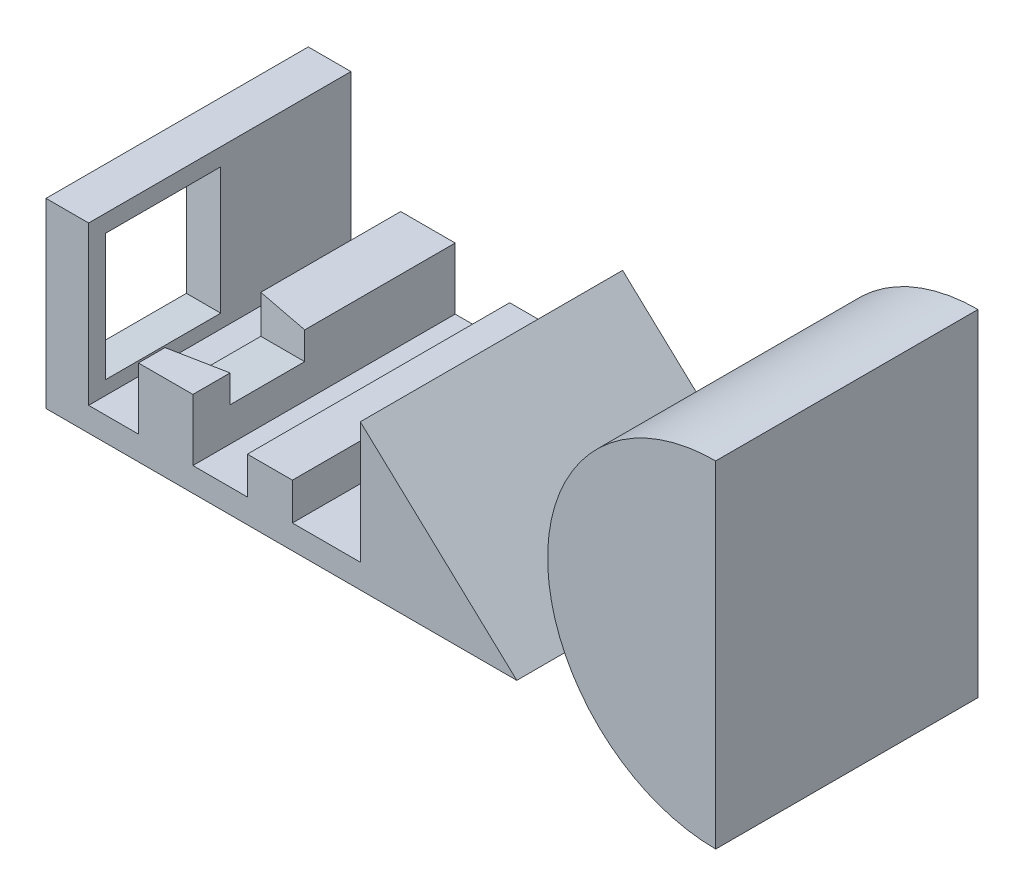
ISO-10303-21;
HEADER;
FILE_DESCRIPTION(('STEP AP214'),'2;1');
FILE_NAME('part.step','',(''),(''),'','','');
FILE_SCHEMA(('AUTOMOTIVE_DESIGN { 1 0 10303 214 1 1 1 1 }'));
ENDSEC;
DATA;
#1=APPLICATION_CONTEXT('core data for automotive mechanical design processes');
#2=APPLICATION_PROTOCOL_DEFINITION('international standard','automotive_design',2000,#1);
#3=PRODUCT_CONTEXT('',#1,'mechanical');
#4=PRODUCT('Part','Part','',(#3));
#5=PRODUCT_RELATED_PRODUCT_CATEGORY('part','',(#4));
#6=PRODUCT_DEFINITION_FORMATION('','',#4);
#7=PRODUCT_DEFINITION_CONTEXT('part definition',#1,'design');
#8=PRODUCT_DEFINITION('design','',#6,#7);
#9=PRODUCT_DEFINITION_SHAPE('','',#8);
#10=(LENGTH_UNIT() NAMED_UNIT(*) SI_UNIT(.MILLI.,.METRE.));
#11=(NAMED_UNIT(*) PLANE_ANGLE_UNIT() SI_UNIT($,.RADIAN.));
#12=(NAMED_UNIT(*) SI_UNIT($,.STERADIAN.) SOLID_ANGLE_UNIT());
#13=UNCERTAINTY_MEASURE_WITH_UNIT(LENGTH_MEASURE(1.E-05),#10,'distance_accuracy_value','');
#14=(GEOMETRIC_REPRESENTATION_CONTEXT(3) GLOBAL_UNCERTAINTY_ASSIGNED_CONTEXT((#13)) GLOBAL_UNIT_ASSIGNED_CONTEXT((#10,
#11,#12)) REPRESENTATION_CONTEXT('',''));
#15=CARTESIAN_POINT('',(0.,0.,0.));
#16=DIRECTION('',(0.,0.,1.));
#17=DIRECTION('',(1.,0.,0.));
#18=AXIS2_PLACEMENT_3D('',#15,#16,#17);
#19=CARTESIAN_POINT('',(972.879836168344,176.420111136161,190.5));
#20=DIRECTION('',(0.,0.,-1.));
#21=DIRECTION('',(-1.,0.,0.));
#22=AXIS2_PLACEMENT_3D('',#19,#20,#21);
#23=CYLINDRICAL_SURFACE('',#22,244.183019467738);
#24=CARTESIAN_POINT('',(972.879836168344,176.420111136161,-190.5));
#25=DIRECTION('',(0.,0.,1.));
#26=DIRECTION('',(1.,0.,0.));
#27=AXIS2_PLACEMENT_3D('',#24,#25,#26);
#28=CIRCLE('',#27,244.183019467738);
#29=CARTESIAN_POINT('',(972.879836168344,420.603130603899,-190.5));
#30=VERTEX_POINT('',#29);
#31=CARTESIAN_POINT('',(972.879836168344,-67.7629083315776,-190.5));
#32=VERTEX_POINT('',#31);
#33=EDGE_CURVE('E79',#30,#32,#28,.T.);
#34=ORIENTED_EDGE('',*,*,#33,.T.);
#35=DIRECTION('',(0.,0.,-1.));
#36=VECTOR('',#35,1.);
#37=CARTESIAN_POINT('',(972.879836168344,-67.7629083315776,190.5));
#38=LINE('',#37,#36);
#39=CARTESIAN_POINT('',(972.879836168344,-67.7629083315776,190.5));
#40=VERTEX_POINT('',#39);
#41=EDGE_CURVE('E12',#40,#32,#38,.T.);
#42=ORIENTED_EDGE('',*,*,#41,.F.);
#43=CARTESIAN_POINT('',(972.879836168344,176.420111136161,190.5));
#44=DIRECTION('',(0.,0.,1.));
#45=DIRECTION('',(1.,0.,0.));
#46=AXIS2_PLACEMENT_3D('',#43,#44,#45);
#47=CIRCLE('',#46,244.183019467738);
#48=CARTESIAN_POINT('',(972.879836168344,420.603130603899,190.5));
#49=VERTEX_POINT('',#48);
#50=EDGE_CURVE('E78',#49,#40,#47,.T.);
#51=ORIENTED_EDGE('',*,*,#50,.F.);
#52=DIRECTION('',(0.,0.,-1.));
#53=VECTOR('',#52,1.);
#54=CARTESIAN_POINT('',(972.879836168344,420.603130603899,190.5));
#55=LINE('',#54,#53);
#56=EDGE_CURVE('E56',#49,#30,#55,.T.);
#57=ORIENTED_EDGE('',*,*,#56,.T.);
#58=EDGE_LOOP('',(#34,#42,#51,#57));
#59=FACE_BOUND('',#58,.T.);
#60=ADVANCED_FACE('F48',(#59),#23,.T.);
#61=CARTESIAN_POINT('',(972.879836168344,420.603130603899,190.5));
#62=DIRECTION('',(-1.,0.,0.));
#63=DIRECTION('',(0.,0.,1.));
#64=AXIS2_PLACEMENT_3D('',#61,#62,#63);
#65=PLANE('',#64);
#66=DIRECTION('',(0.,1.,0.));
#67=VECTOR('',#66,1.);
#68=CARTESIAN_POINT('',(972.879836168344,420.603130603899,-190.5));
#69=LINE('',#68,#67);
#70=EDGE_CURVE('E71',#32,#30,#69,.T.);
#71=ORIENTED_EDGE('',*,*,#70,.T.);
#72=ORIENTED_EDGE('',*,*,#56,.F.);
#73=DIRECTION('',(0.,1.,0.));
#74=VECTOR('',#73,1.);
#75=CARTESIAN_POINT('',(972.879836168344,420.603130603899,190.5));
#76=LINE('',#75,#74);
#77=EDGE_CURVE('E63',#40,#49,#76,.T.);
#78=ORIENTED_EDGE('',*,*,#77,.F.);
#79=ORIENTED_EDGE('',*,*,#41,.T.);
#80=EDGE_LOOP('',(#71,#72,#78,#79));
#81=FACE_BOUND('',#80,.T.);
#82=ADVANCED_FACE('F74',(#81),#65,.F.);
#83=CARTESIAN_POINT('',(972.879836168344,176.420111136161,190.5));
#84=DIRECTION('',(0.,0.,1.));
#85=DIRECTION('',(1.,0.,0.));
#86=AXIS2_PLACEMENT_3D('',#83,#84,#85);
#87=PLANE('',#86);
#88=ORIENTED_EDGE('',*,*,#50,.T.);
#89=ORIENTED_EDGE('',*,*,#77,.T.);
#90=EDGE_LOOP('',(#88,#89));
#91=FACE_BOUND('',#90,.T.);
#92=ADVANCED_FACE('F86',(#91),#87,.T.);
#93=CARTESIAN_POINT('',(972.879836168344,176.420111136161,-190.5));
#94=DIRECTION('',(0.,0.,1.));
#95=DIRECTION('',(1.,0.,0.));
#96=AXIS2_PLACEMENT_3D('',#93,#94,#95);
#97=PLANE('',#96);
#98=ORIENTED_EDGE('',*,*,#33,.F.);
#99=ORIENTED_EDGE('',*,*,#70,.F.);
#100=EDGE_LOOP('',(#98,#99));
#101=FACE_BOUND('',#100,.T.);
#102=ADVANCED_FACE('F82',(#101),#97,.F.);
#103=CLOSED_SHELL('',(#60,#82,#92,#102));
#104=MANIFOLD_SOLID_BREP('B2',#103);
#105=CARTESIAN_POINT('',(134.22680343751,124.475283529657,190.5));
#106=DIRECTION('',(0.,-1.,0.));
#107=DIRECTION('',(0.,0.,-1.));
#108=AXIS2_PLACEMENT_3D('',#105,#106,#107);
#109=PLANE('',#108);
#110=DIRECTION('',(0.,0.,-1.));
#111=VECTOR('',#110,1.);
#112=CARTESIAN_POINT('',(134.22680343751,124.475283529657,190.5));
#113=LINE('',#112,#111);
#114=CARTESIAN_POINT('',(134.22680343751,124.475283529657,12.672751750011));
#115=VERTEX_POINT('',#114);
#116=CARTESIAN_POINT('',(134.22680343751,124.475283529657,-190.5));
#117=VERTEX_POINT('',#116);
#118=EDGE_CURVE('E419',#115,#117,#113,.T.);
#119=ORIENTED_EDGE('',*,*,#118,.F.);
#120=DIRECTION('',(0.981627183447664,0.,0.190808995376545));
#121=VECTOR('',#120,1.);
#122=CARTESIAN_POINT('',(167.534433279237,124.475283529657,19.1470991352906));
#123=LINE('',#122,#121);
#124=CARTESIAN_POINT('',(213.386200336555,124.475283529657,28.0597797904026));
#125=VERTEX_POINT('',#124);
#126=EDGE_CURVE('E334',#115,#125,#123,.T.);
#127=ORIENTED_EDGE('',*,*,#126,.T.);
#128=DIRECTION('',(0.,0.,-1.));
#129=VECTOR('',#128,1.);
#130=CARTESIAN_POINT('',(213.386200336555,124.475283529657,190.5));
#131=LINE('',#130,#129);
#132=CARTESIAN_POINT('',(213.386200336555,124.475283529657,-190.5));
#133=VERTEX_POINT('',#132);
#134=EDGE_CURVE('E423',#125,#133,#131,.T.);
#135=ORIENTED_EDGE('',*,*,#134,.T.);
#136=DIRECTION('',(-1.,0.,0.));
#137=VECTOR('',#136,1.);
#138=CARTESIAN_POINT('',(134.22680343751,124.475283529657,-190.5));
#139=LINE('',#138,#137);
#140=EDGE_CURVE('E393',#133,#117,#139,.T.);
#141=ORIENTED_EDGE('',*,*,#140,.T.);
#142=EDGE_LOOP('',(#119,#127,#135,#141));
#143=FACE_BOUND('',#142,.T.);
#144=ADVANCED_FACE('F120',(#143),#109,.F.);
#145=CARTESIAN_POINT('',(683.937189207744,0.,190.5));
#146=DIRECTION('',(0.,1.,0.));
#147=DIRECTION('',(0.,0.,1.));
#148=AXIS2_PLACEMENT_3D('',#145,#146,#147);
#149=PLANE('',#148);
#150=DIRECTION('',(1.,0.,0.));
#151=VECTOR('',#150,1.);
#152=CARTESIAN_POINT('',(683.937189207744,0.,-190.5));
#153=LINE('',#152,#151);
#154=CARTESIAN_POINT('',(0.,0.,-190.5));
#155=VERTEX_POINT('',#154);
#156=CARTESIAN_POINT('',(683.937189207744,0.,-190.5));
#157=VERTEX_POINT('',#156);
#158=EDGE_CURVE('E340',#155,#157,#153,.T.);
#159=ORIENTED_EDGE('',*,*,#158,.T.);
#160=DIRECTION('',(0.,0.,-1.));
#161=VECTOR('',#160,1.);
#162=CARTESIAN_POINT('',(683.937189207744,0.,190.5));
#163=LINE('',#162,#161);
#164=CARTESIAN_POINT('',(683.937189207744,0.,190.5));
#165=VERTEX_POINT('',#164);
#166=EDGE_CURVE('E46',#165,#157,#163,.T.);
#167=ORIENTED_EDGE('',*,*,#166,.F.);
#168=DIRECTION('',(1.,0.,0.));
#169=VECTOR('',#168,1.);
#170=CARTESIAN_POINT('',(683.937189207744,0.,190.5));
#171=LINE('',#170,#169);
#172=CARTESIAN_POINT('',(0.,0.,190.5));
#173=VERTEX_POINT('',#172);
#174=EDGE_CURVE('E341',#173,#165,#171,.T.);
#175=ORIENTED_EDGE('',*,*,#174,.F.);
#176=DIRECTION('',(0.,0.,-1.));
#177=VECTOR('',#176,1.);
#178=CARTESIAN_POINT('',(0.,0.,190.5));
#179=LINE('',#178,#177);
#180=EDGE_CURVE('E373',#173,#155,#179,.T.);
#181=ORIENTED_EDGE('',*,*,#180,.T.);
#182=EDGE_LOOP('',(#159,#167,#175,#181));
#183=FACE_BOUND('',#182,.T.);
#184=ADVANCED_FACE('F122',(#183),#149,.F.);
#185=CARTESIAN_POINT('',(456.600579214778,211.665343882228,190.5));
#186=DIRECTION('',(-0.681430807762917,-0.731882541280756,0.));
#187=DIRECTION('',(0.731882541280756,-0.681430807762917,0.));
#188=AXIS2_PLACEMENT_3D('',#185,#186,#187);
#189=PLANE('',#188);
#190=DIRECTION('',(-0.731882541280756,0.681430807762917,0.));
#191=VECTOR('',#190,1.);
#192=CARTESIAN_POINT('',(456.600579214778,211.665343882228,-190.5));
#193=LINE('',#192,#191);
#194=CARTESIAN_POINT('',(456.600579214778,211.665343882228,-190.5));
#195=VERTEX_POINT('',#194);
#196=EDGE_CURVE('E376',#157,#195,#193,.T.);
#197=ORIENTED_EDGE('',*,*,#196,.T.);
#198=DIRECTION('',(0.,0.,-1.));
#199=VECTOR('',#198,1.);
#200=CARTESIAN_POINT('',(456.600579214778,211.665343882228,190.5));
#201=LINE('',#200,#199);
#202=CARTESIAN_POINT('',(456.600579214778,211.665343882228,190.5));
#203=VERTEX_POINT('',#202);
#204=EDGE_CURVE('E128',#203,#195,#201,.T.);
#205=ORIENTED_EDGE('',*,*,#204,.F.);
#206=DIRECTION('',(-0.731882541280756,0.681430807762917,0.));
#207=VECTOR('',#206,1.);
#208=CARTESIAN_POINT('',(456.600579214778,211.665343882228,190.5));
#209=LINE('',#208,#207);
#210=EDGE_CURVE('E344',#165,#203,#209,.T.);
#211=ORIENTED_EDGE('',*,*,#210,.F.);
#212=ORIENTED_EDGE('',*,*,#166,.T.);
#213=EDGE_LOOP('',(#197,#205,#211,#212));
#214=FACE_BOUND('',#213,.T.);
#215=ADVANCED_FACE('F472',(#214),#189,.F.);
#216=CARTESIAN_POINT('',(456.600579214778,34.9907479046501,190.5));
#217=DIRECTION('',(1.,0.,0.));
#218=DIRECTION('',(0.,0.,-1.));
#219=AXIS2_PLACEMENT_3D('',#216,#217,#218);
#220=PLANE('',#219);
#221=DIRECTION('',(0.,-1.,0.));
#222=VECTOR('',#221,1.);
#223=CARTESIAN_POINT('',(456.600579214778,34.9907479046501,-190.5));
#224=LINE('',#223,#222);
#225=CARTESIAN_POINT('',(456.600579214778,34.9907479046501,-190.5));
#226=VERTEX_POINT('',#225);
#227=EDGE_CURVE('E378',#195,#226,#224,.T.);
#228=ORIENTED_EDGE('',*,*,#227,.T.);
#229=DIRECTION('',(0.,0.,-1.));
#230=VECTOR('',#229,1.);
#231=CARTESIAN_POINT('',(456.600579214778,34.9907479046501,190.5));
#232=LINE('',#231,#230);
#233=CARTESIAN_POINT('',(456.600579214778,34.9907479046501,190.5));
#234=VERTEX_POINT('',#233);
#235=EDGE_CURVE('E442',#234,#226,#232,.T.);
#236=ORIENTED_EDGE('',*,*,#235,.F.);
#237=DIRECTION('',(0.,-1.,0.));
#238=VECTOR('',#237,1.);
#239=CARTESIAN_POINT('',(456.600579214778,34.9907479046501,190.5));
#240=LINE('',#239,#238);
#241=EDGE_CURVE('E347',#203,#234,#240,.T.);
#242=ORIENTED_EDGE('',*,*,#241,.F.);
#243=ORIENTED_EDGE('',*,*,#204,.T.);
#244=EDGE_LOOP('',(#228,#236,#242,#243));
#245=FACE_BOUND('',#244,.T.);
#246=ADVANCED_FACE('F449',(#245),#220,.F.);
#247=CARTESIAN_POINT('',(357.938142500027,34.9907479046501,190.5));
#248=DIRECTION('',(0.,-1.,0.));
#249=DIRECTION('',(0.,0.,-1.));
#250=AXIS2_PLACEMENT_3D('',#247,#248,#249);
#251=PLANE('',#250);
#252=DIRECTION('',(-1.,0.,0.));
#253=VECTOR('',#252,1.);
#254=CARTESIAN_POINT('',(357.938142500027,34.9907479046501,-190.5));
#255=LINE('',#254,#253);
#256=CARTESIAN_POINT('',(357.938142500027,34.9907479046501,-190.5));
#257=VERTEX_POINT('',#256);
#258=EDGE_CURVE('E380',#226,#257,#255,.T.);
#259=ORIENTED_EDGE('',*,*,#258,.T.);
#260=DIRECTION('',(0.,0.,-1.));
#261=VECTOR('',#260,1.);
#262=CARTESIAN_POINT('',(357.938142500027,34.9907479046501,190.5));
#263=LINE('',#262,#261);
#264=CARTESIAN_POINT('',(357.938142500027,34.9907479046501,190.5));
#265=VERTEX_POINT('',#264);
#266=EDGE_CURVE('E439',#265,#257,#263,.T.);
#267=ORIENTED_EDGE('',*,*,#266,.F.);
#268=DIRECTION('',(-1.,0.,0.));
#269=VECTOR('',#268,1.);
#270=CARTESIAN_POINT('',(357.938142500027,34.9907479046501,190.5));
#271=LINE('',#270,#269);
#272=EDGE_CURVE('E349',#234,#265,#271,.T.);
#273=ORIENTED_EDGE('',*,*,#272,.F.);
#274=ORIENTED_EDGE('',*,*,#235,.T.);
#275=EDGE_LOOP('',(#259,#267,#273,#274));
#276=FACE_BOUND('',#275,.T.);
#277=ADVANCED_FACE('F460',(#276),#251,.F.);
#278=CARTESIAN_POINT('',(357.938142500027,88.9109168068977,190.5));
#279=DIRECTION('',(-1.,0.,0.));
#280=DIRECTION('',(0.,0.,1.));
#281=AXIS2_PLACEMENT_3D('',#278,#279,#280);
#282=PLANE('',#281);
#283=DIRECTION('',(0.,1.,0.));
#284=VECTOR('',#283,1.);
#285=CARTESIAN_POINT('',(357.938142500027,88.9109168068977,-190.5));
#286=LINE('',#285,#284);
#287=CARTESIAN_POINT('',(357.938142500027,88.9109168068977,-190.5));
#288=VERTEX_POINT('',#287);
#289=EDGE_CURVE('E382',#257,#288,#286,.T.);
#290=ORIENTED_EDGE('',*,*,#289,.T.);
#291=DIRECTION('',(0.,0.,-1.));
#292=VECTOR('',#291,1.);
#293=CARTESIAN_POINT('',(357.938142500027,88.9109168068977,190.5));
#294=LINE('',#293,#292);
#295=CARTESIAN_POINT('',(357.938142500027,88.9109168068977,190.5));
#296=VERTEX_POINT('',#295);
#297=EDGE_CURVE('E436',#296,#288,#294,.T.);
#298=ORIENTED_EDGE('',*,*,#297,.F.);
#299=DIRECTION('',(0.,1.,0.));
#300=VECTOR('',#299,1.);
#301=CARTESIAN_POINT('',(357.938142500027,88.9109168068977,190.5));
#302=LINE('',#301,#300);
#303=EDGE_CURVE('E351',#265,#296,#302,.T.);
#304=ORIENTED_EDGE('',*,*,#303,.F.);
#305=ORIENTED_EDGE('',*,*,#266,.T.);
#306=EDGE_LOOP('',(#290,#298,#304,#305));
#307=FACE_BOUND('',#306,.T.);
#308=ADVANCED_FACE('F464',(#307),#282,.F.);
#309=CARTESIAN_POINT('',(292.545597235599,88.9109168068977,190.5));
#310=DIRECTION('',(0.,-1.,0.));
#311=DIRECTION('',(0.,0.,-1.));
#312=AXIS2_PLACEMENT_3D('',#309,#310,#311);
#313=PLANE('',#312);
#314=DIRECTION('',(-1.,0.,0.));
#315=VECTOR('',#314,1.);
#316=CARTESIAN_POINT('',(292.545597235599,88.9109168068977,-190.5));
#317=LINE('',#316,#315);
#318=CARTESIAN_POINT('',(292.545597235599,88.9109168068977,-190.5));
#319=VERTEX_POINT('',#318);
#320=EDGE_CURVE('E384',#288,#319,#317,.T.);
#321=ORIENTED_EDGE('',*,*,#320,.T.);
#322=DIRECTION('',(0.,0.,-1.));
#323=VECTOR('',#322,1.);
#324=CARTESIAN_POINT('',(292.545597235599,88.9109168068977,190.5));
#325=LINE('',#324,#323);
#326=CARTESIAN_POINT('',(292.545597235599,88.9109168068977,190.5));
#327=VERTEX_POINT('',#326);
#328=EDGE_CURVE('E433',#327,#319,#325,.T.);
#329=ORIENTED_EDGE('',*,*,#328,.F.);
#330=DIRECTION('',(-1.,0.,0.));
#331=VECTOR('',#330,1.);
#332=CARTESIAN_POINT('',(292.545597235599,88.9109168068977,190.5));
#333=LINE('',#332,#331);
#334=EDGE_CURVE('E353',#296,#327,#333,.T.);
#335=ORIENTED_EDGE('',*,*,#334,.F.);
#336=ORIENTED_EDGE('',*,*,#297,.T.);
#337=EDGE_LOOP('',(#321,#329,#335,#336));
#338=FACE_BOUND('',#337,.T.);
#339=ADVANCED_FACE('F517',(#338),#313,.F.);
#340=CARTESIAN_POINT('',(292.545597235599,34.9907479046501,190.5));
#341=DIRECTION('',(1.,0.,0.));
#342=DIRECTION('',(0.,0.,-1.));
#343=AXIS2_PLACEMENT_3D('',#340,#341,#342);
#344=PLANE('',#343);
#345=DIRECTION('',(0.,-1.,0.));
#346=VECTOR('',#345,1.);
#347=CARTESIAN_POINT('',(292.545597235599,34.9907479046501,-190.5));
#348=LINE('',#347,#346);
#349=CARTESIAN_POINT('',(292.545597235599,34.9907479046501,-190.5));
#350=VERTEX_POINT('',#349);
#351=EDGE_CURVE('E386',#319,#350,#348,.T.);
#352=ORIENTED_EDGE('',*,*,#351,.T.);
#353=DIRECTION('',(0.,0.,-1.));
#354=VECTOR('',#353,1.);
#355=CARTESIAN_POINT('',(292.545597235599,34.9907479046501,190.5));
#356=LINE('',#355,#354);
#357=CARTESIAN_POINT('',(292.545597235599,34.9907479046501,190.5));
#358=VERTEX_POINT('',#357);
#359=EDGE_CURVE('E430',#358,#350,#356,.T.);
#360=ORIENTED_EDGE('',*,*,#359,.F.);
#361=DIRECTION('',(0.,-1.,0.));
#362=VECTOR('',#361,1.);
#363=CARTESIAN_POINT('',(292.545597235599,34.9907479046501,190.5));
#364=LINE('',#363,#362);
#365=EDGE_CURVE('E355',#327,#358,#364,.T.);
#366=ORIENTED_EDGE('',*,*,#365,.F.);
#367=ORIENTED_EDGE('',*,*,#328,.T.);
#368=EDGE_LOOP('',(#352,#360,#366,#367));
#369=FACE_BOUND('',#368,.T.);
#370=ADVANCED_FACE('F515',(#369),#344,.F.);
#371=CARTESIAN_POINT('',(213.386200336555,34.9907479046501,190.5));
#372=DIRECTION('',(0.,-1.,0.));
#373=DIRECTION('',(0.,0.,-1.));
#374=AXIS2_PLACEMENT_3D('',#371,#372,#373);
#375=PLANE('',#374);
#376=DIRECTION('',(-1.,0.,0.));
#377=VECTOR('',#376,1.);
#378=CARTESIAN_POINT('',(213.386200336555,34.9907479046501,-190.5));
#379=LINE('',#378,#377);
#380=CARTESIAN_POINT('',(213.386200336555,34.9907479046501,-190.5));
#381=VERTEX_POINT('',#380);
#382=EDGE_CURVE('E388',#350,#381,#379,.T.);
#383=ORIENTED_EDGE('',*,*,#382,.T.);
#384=DIRECTION('',(0.,0.,-1.));
#385=VECTOR('',#384,1.);
#386=CARTESIAN_POINT('',(213.386200336555,34.9907479046501,190.5));
#387=LINE('',#386,#385);
#388=CARTESIAN_POINT('',(213.386200336555,34.9907479046501,190.5));
#389=VERTEX_POINT('',#388);
#390=EDGE_CURVE('E427',#389,#381,#387,.T.);
#391=ORIENTED_EDGE('',*,*,#390,.F.);
#392=DIRECTION('',(-1.,0.,0.));
#393=VECTOR('',#392,1.);
#394=CARTESIAN_POINT('',(213.386200336555,34.9907479046501,190.5));
#395=LINE('',#394,#393);
#396=EDGE_CURVE('E357',#358,#389,#395,.T.);
#397=ORIENTED_EDGE('',*,*,#396,.F.);
#398=ORIENTED_EDGE('',*,*,#359,.T.);
#399=EDGE_LOOP('',(#383,#391,#397,#398));
#400=FACE_BOUND('',#399,.T.);
#401=ADVANCED_FACE('F511',(#400),#375,.F.);
#402=CARTESIAN_POINT('',(213.386200336555,124.475283529657,190.5));
#403=DIRECTION('',(-1.,0.,0.));
#404=DIRECTION('',(0.,0.,1.));
#405=AXIS2_PLACEMENT_3D('',#402,#403,#404);
#406=PLANE('',#405);
#407=ORIENTED_EDGE('',*,*,#134,.F.);
#408=DIRECTION('',(0.,-1.,0.));
#409=VECTOR('',#408,1.);
#410=CARTESIAN_POINT('',(213.386200336555,124.475283529657,28.0597797904026));
#411=LINE('',#410,#409);
#412=CARTESIAN_POINT('',(213.386200336555,84.4606896335025,28.0597797904026));
#413=VERTEX_POINT('',#412);
#414=EDGE_CURVE('E337',#125,#413,#411,.T.);
#415=ORIENTED_EDGE('',*,*,#414,.T.);
#416=DIRECTION('',(0.,0.,1.));
#417=VECTOR('',#416,1.);
#418=CARTESIAN_POINT('',(213.386200336555,84.4606896335025,190.5));
#419=LINE('',#418,#417);
#420=CARTESIAN_POINT('',(213.386200336555,84.4606896335025,136.438587199263));
#421=VERTEX_POINT('',#420);
#422=EDGE_CURVE('E312',#413,#421,#419,.T.);
#423=ORIENTED_EDGE('',*,*,#422,.T.);
#424=DIRECTION('',(0.,1.,0.));
#425=VECTOR('',#424,1.);
#426=CARTESIAN_POINT('',(213.386200336555,124.475283529657,136.438587199263));
#427=LINE('',#426,#425);
#428=CARTESIAN_POINT('',(213.386200336555,124.475283529657,136.438587199263));
#429=VERTEX_POINT('',#428);
#430=EDGE_CURVE('E322',#421,#429,#427,.T.);
#431=ORIENTED_EDGE('',*,*,#430,.T.);
#432=CARTESIAN_POINT('',(213.386200336555,124.475283529657,190.5));
#433=VERTEX_POINT('',#432);
#434=EDGE_CURVE('E424',#433,#429,#131,.T.);
#435=ORIENTED_EDGE('',*,*,#434,.F.);
#436=DIRECTION('',(0.,1.,0.));
#437=VECTOR('',#436,1.);
#438=CARTESIAN_POINT('',(213.386200336555,124.475283529657,190.5));
#439=LINE('',#438,#437);
#440=EDGE_CURVE('E359',#389,#433,#439,.T.);
#441=ORIENTED_EDGE('',*,*,#440,.F.);
#442=ORIENTED_EDGE('',*,*,#390,.T.);
#443=DIRECTION('',(0.,1.,0.));
#444=VECTOR('',#443,1.);
#445=CARTESIAN_POINT('',(213.386200336555,124.475283529657,-190.5));
#446=LINE('',#445,#444);
#447=EDGE_CURVE('E390',#381,#133,#446,.T.);
#448=ORIENTED_EDGE('',*,*,#447,.T.);
#449=EDGE_LOOP('',(#407,#415,#423,#431,#435,#441,#442,#448));
#450=FACE_BOUND('',#449,.T.);
#451=ADVANCED_FACE('F505',(#450),#406,.F.);
#452=ORIENTED_EDGE('',*,*,#434,.T.);
#453=DIRECTION('',(-0.981627183447664,0.,0.190808995376545));
#454=VECTOR('',#453,1.);
#455=CARTESIAN_POINT('',(126.982963673746,124.475283529657,153.23367505228));
#456=LINE('',#455,#454);
#457=CARTESIAN_POINT('',(134.22680343751,124.475283529657,151.825615239655));
#458=VERTEX_POINT('',#457);
#459=EDGE_CURVE('E319',#429,#458,#456,.T.);
#460=ORIENTED_EDGE('',*,*,#459,.T.);
#461=CARTESIAN_POINT('',(134.22680343751,124.475283529657,190.5));
#462=VERTEX_POINT('',#461);
#463=EDGE_CURVE('E420',#462,#458,#113,.T.);
#464=ORIENTED_EDGE('',*,*,#463,.F.);
#465=DIRECTION('',(-1.,0.,0.));
#466=VECTOR('',#465,1.);
#467=CARTESIAN_POINT('',(134.22680343751,124.475283529657,190.5));
#468=LINE('',#467,#466);
#469=EDGE_CURVE('E361',#433,#462,#468,.T.);
#470=ORIENTED_EDGE('',*,*,#469,.F.);
#471=EDGE_LOOP('',(#452,#460,#464,#470));
#472=FACE_BOUND('',#471,.T.);
#473=ADVANCED_FACE('F528',(#472),#109,.F.);
#474=CARTESIAN_POINT('',(134.22680343751,34.9907479046501,190.5));
#475=DIRECTION('',(1.,0.,0.));
#476=DIRECTION('',(0.,0.,-1.));
#477=AXIS2_PLACEMENT_3D('',#474,#475,#476);
#478=PLANE('',#477);
#479=DIRECTION('',(0.,0.,-1.));
#480=VECTOR('',#479,1.);
#481=CARTESIAN_POINT('',(134.22680343751,69.0736615931108,190.5));
#482=LINE('',#481,#480);
#483=CARTESIAN_POINT('',(134.22680343751,69.0736615931108,151.825615239655));
#484=VERTEX_POINT('',#483);
#485=CARTESIAN_POINT('',(134.22680343751,69.0736615931108,12.672751750011));
#486=VERTEX_POINT('',#485);
#487=EDGE_CURVE('E309',#484,#486,#482,.T.);
#488=ORIENTED_EDGE('',*,*,#487,.T.);
#489=DIRECTION('',(0.,1.,0.));
#490=VECTOR('',#489,1.);
#491=CARTESIAN_POINT('',(134.22680343751,34.9907479046501,12.672751750011));
#492=LINE('',#491,#490);
#493=EDGE_CURVE('E331',#486,#115,#492,.T.);
#494=ORIENTED_EDGE('',*,*,#493,.T.);
#495=ORIENTED_EDGE('',*,*,#118,.T.);
#496=DIRECTION('',(0.,-1.,0.));
#497=VECTOR('',#496,1.);
#498=CARTESIAN_POINT('',(134.22680343751,34.9907479046501,-190.5));
#499=LINE('',#498,#497);
#500=CARTESIAN_POINT('',(134.22680343751,34.9907479046501,-190.5));
#501=VERTEX_POINT('',#500);
#502=EDGE_CURVE('E396',#117,#501,#499,.T.);
#503=ORIENTED_EDGE('',*,*,#502,.T.);
#504=DIRECTION('',(0.,0.,-1.));
#505=VECTOR('',#504,1.);
#506=CARTESIAN_POINT('',(134.22680343751,34.9907479046501,190.5));
#507=LINE('',#506,#505);
#508=CARTESIAN_POINT('',(134.22680343751,34.9907479046501,190.5));
#509=VERTEX_POINT('',#508);
#510=EDGE_CURVE('E416',#509,#501,#507,.T.);
#511=ORIENTED_EDGE('',*,*,#510,.F.);
#512=DIRECTION('',(0.,-1.,0.));
#513=VECTOR('',#512,1.);
#514=CARTESIAN_POINT('',(134.22680343751,34.9907479046501,190.5));
#515=LINE('',#514,#513);
#516=EDGE_CURVE('E363',#462,#509,#515,.T.);
#517=ORIENTED_EDGE('',*,*,#516,.F.);
#518=ORIENTED_EDGE('',*,*,#463,.T.);
#519=DIRECTION('',(0.,-1.,0.));
#520=VECTOR('',#519,1.);
#521=CARTESIAN_POINT('',(134.22680343751,34.9907479046501,151.825615239655));
#522=LINE('',#521,#520);
#523=EDGE_CURVE('E316',#458,#484,#522,.T.);
#524=ORIENTED_EDGE('',*,*,#523,.T.);
#525=EDGE_LOOP('',(#488,#494,#495,#503,#511,#517,#518,#524));
#526=FACE_BOUND('',#525,.T.);
#527=ADVANCED_FACE('F497',(#526),#478,.F.);
#528=CARTESIAN_POINT('',(61.9508323557739,34.9907479046501,190.5));
#529=DIRECTION('',(0.,-1.,0.));
#530=DIRECTION('',(0.,0.,-1.));
#531=AXIS2_PLACEMENT_3D('',#528,#529,#530);
#532=PLANE('',#531);
#533=DIRECTION('',(-1.,0.,0.));
#534=VECTOR('',#533,1.);
#535=CARTESIAN_POINT('',(61.9508323557739,34.9907479046501,-190.5));
#536=LINE('',#535,#534);
#537=CARTESIAN_POINT('',(61.9508323557739,34.9907479046501,-190.5));
#538=VERTEX_POINT('',#537);
#539=EDGE_CURVE('E398',#501,#538,#536,.T.);
#540=ORIENTED_EDGE('',*,*,#539,.T.);
#541=DIRECTION('',(0.,0.,-1.));
#542=VECTOR('',#541,1.);
#543=CARTESIAN_POINT('',(61.9508323557739,34.9907479046501,190.5));
#544=LINE('',#543,#542);
#545=CARTESIAN_POINT('',(61.9508323557739,34.9907479046501,190.5));
#546=VERTEX_POINT('',#545);
#547=EDGE_CURVE('E413',#546,#538,#544,.T.);
#548=ORIENTED_EDGE('',*,*,#547,.F.);
#549=DIRECTION('',(-1.,0.,0.));
#550=VECTOR('',#549,1.);
#551=CARTESIAN_POINT('',(61.9508323557739,34.9907479046501,190.5));
#552=LINE('',#551,#550);
#553=EDGE_CURVE('E365',#509,#546,#552,.T.);
#554=ORIENTED_EDGE('',*,*,#553,.F.);
#555=ORIENTED_EDGE('',*,*,#510,.T.);
#556=EDGE_LOOP('',(#540,#548,#554,#555));
#557=FACE_BOUND('',#556,.T.);
#558=ADVANCED_FACE('F492',(#557),#532,.F.);
#559=CARTESIAN_POINT('',(61.9508323557739,264.438275148257,190.5));
#560=DIRECTION('',(-1.,0.,0.));
#561=DIRECTION('',(0.,0.,1.));
#562=AXIS2_PLACEMENT_3D('',#559,#560,#561);
#563=PLANE('',#562);
#564=DIRECTION('',(0.,0.,-1.));
#565=VECTOR('',#564,1.);
#566=CARTESIAN_POINT('',(61.9508323557739,239.172663910376,190.5));
#567=LINE('',#566,#565);
#568=CARTESIAN_POINT('',(61.9508323557739,239.172663910376,165.874640841752));
#569=VERTEX_POINT('',#568);
#570=CARTESIAN_POINT('',(61.9508323557739,239.172663910376,-1.37627385208572));
#571=VERTEX_POINT('',#570);
#572=EDGE_CURVE('E325',#569,#571,#567,.T.);
#573=ORIENTED_EDGE('',*,*,#572,.T.);
#574=DIRECTION('',(0.,-1.,0.));
#575=VECTOR('',#574,1.);
#576=CARTESIAN_POINT('',(61.9508323557739,264.438275148257,-1.37627385208569));
#577=LINE('',#576,#575);
#578=CARTESIAN_POINT('',(61.9508323557739,55.0246359910141,-1.37627385208572));
#579=VERTEX_POINT('',#578);
#580=EDGE_CURVE('E328',#571,#579,#577,.T.);
#581=ORIENTED_EDGE('',*,*,#580,.T.);
#582=DIRECTION('',(0.,0.,1.));
#583=VECTOR('',#582,1.);
#584=CARTESIAN_POINT('',(61.9508323557739,55.0246359910142,190.5));
#585=LINE('',#584,#583);
#586=CARTESIAN_POINT('',(61.9508323557739,55.0246359910142,165.874640841752));
#587=VERTEX_POINT('',#586);
#588=EDGE_CURVE('E304',#579,#587,#585,.T.);
#589=ORIENTED_EDGE('',*,*,#588,.T.);
#590=DIRECTION('',(0.,1.,0.));
#591=VECTOR('',#590,1.);
#592=CARTESIAN_POINT('',(61.9508323557739,264.438275148257,165.874640841752));
#593=LINE('',#592,#591);
#594=EDGE_CURVE('E280',#587,#569,#593,.T.);
#595=ORIENTED_EDGE('',*,*,#594,.T.);
#596=EDGE_LOOP('',(#573,#581,#589,#595));
#597=FACE_BOUND('',#596,.T.);
#598=DIRECTION('',(0.,1.,0.));
#599=VECTOR('',#598,1.);
#600=CARTESIAN_POINT('',(61.9508323557739,264.438275148257,-190.5));
#601=LINE('',#600,#599);
#602=CARTESIAN_POINT('',(61.9508323557739,264.438275148257,-190.5));
#603=VERTEX_POINT('',#602);
#604=EDGE_CURVE('E400',#538,#603,#601,.T.);
#605=ORIENTED_EDGE('',*,*,#604,.T.);
#606=DIRECTION('',(0.,0.,-1.));
#607=VECTOR('',#606,1.);
#608=CARTESIAN_POINT('',(61.9508323557739,264.438275148257,190.5));
#609=LINE('',#608,#607);
#610=CARTESIAN_POINT('',(61.9508323557739,264.438275148257,190.5));
#611=VERTEX_POINT('',#610);
#612=EDGE_CURVE('E410',#611,#603,#609,.T.);
#613=ORIENTED_EDGE('',*,*,#612,.F.);
#614=DIRECTION('',(0.,1.,0.));
#615=VECTOR('',#614,1.);
#616=CARTESIAN_POINT('',(61.9508323557739,264.438275148257,190.5));
#617=LINE('',#616,#615);
#618=EDGE_CURVE('E367',#546,#611,#617,.T.);
#619=ORIENTED_EDGE('',*,*,#618,.F.);
#620=ORIENTED_EDGE('',*,*,#547,.T.);
#621=EDGE_LOOP('',(#605,#613,#619,#620));
#622=FACE_BOUND('',#621,.T.);
#623=ADVANCED_FACE('F486',(#597,#622),#563,.F.);
#624=CARTESIAN_POINT('',(0.,264.438275148257,190.5));
#625=DIRECTION('',(0.,-1.,0.));
#626=DIRECTION('',(0.,0.,-1.));
#627=AXIS2_PLACEMENT_3D('',#624,#625,#626);
#628=PLANE('',#627);
#629=DIRECTION('',(-1.,0.,0.));
#630=VECTOR('',#629,1.);
#631=CARTESIAN_POINT('',(0.,264.438275148257,-190.5));
#632=LINE('',#631,#630);
#633=CARTESIAN_POINT('',(0.,264.438275148257,-190.5));
#634=VERTEX_POINT('',#633);
#635=EDGE_CURVE('E402',#603,#634,#632,.T.);
#636=ORIENTED_EDGE('',*,*,#635,.T.);
#637=DIRECTION('',(0.,0.,-1.));
#638=VECTOR('',#637,1.);
#639=CARTESIAN_POINT('',(0.,264.438275148257,190.5));
#640=LINE('',#639,#638);
#641=CARTESIAN_POINT('',(0.,264.438275148257,190.5));
#642=VERTEX_POINT('',#641);
#643=EDGE_CURVE('E407',#642,#634,#640,.T.);
#644=ORIENTED_EDGE('',*,*,#643,.F.);
#645=DIRECTION('',(-1.,0.,0.));
#646=VECTOR('',#645,1.);
#647=CARTESIAN_POINT('',(0.,264.438275148257,190.5));
#648=LINE('',#647,#646);
#649=EDGE_CURVE('E369',#611,#642,#648,.T.);
#650=ORIENTED_EDGE('',*,*,#649,.F.);
#651=ORIENTED_EDGE('',*,*,#612,.T.);
#652=EDGE_LOOP('',(#636,#644,#650,#651));
#653=FACE_BOUND('',#652,.T.);
#654=ADVANCED_FACE('F482',(#653),#628,.F.);
#655=CARTESIAN_POINT('',(0.,0.,190.5));
#656=DIRECTION('',(1.,0.,0.));
#657=DIRECTION('',(0.,0.,-1.));
#658=AXIS2_PLACEMENT_3D('',#655,#656,#657);
#659=PLANE('',#658);
#660=DIRECTION('',(0.,0.,1.));
#661=VECTOR('',#660,1.);
#662=CARTESIAN_POINT('',(0.,42.9826140463598,-13.41829579674));
#663=LINE('',#662,#661);
#664=CARTESIAN_POINT('',(0.,42.9826140463598,-13.41829579674));
#665=VERTEX_POINT('',#664);
#666=CARTESIAN_POINT('',(0.,42.9826140463598,177.916662786406));
#667=VERTEX_POINT('',#666);
#668=EDGE_CURVE('E286',#665,#667,#663,.T.);
#669=ORIENTED_EDGE('',*,*,#668,.F.);
#670=DIRECTION('',(0.,-1.,0.));
#671=VECTOR('',#670,1.);
#672=CARTESIAN_POINT('',(0.,251.21468585503,-13.41829579674));
#673=LINE('',#672,#671);
#674=CARTESIAN_POINT('',(0.,251.21468585503,-13.41829579674));
#675=VERTEX_POINT('',#674);
#676=EDGE_CURVE('E292',#675,#665,#673,.T.);
#677=ORIENTED_EDGE('',*,*,#676,.F.);
#678=DIRECTION('',(0.,0.,-1.));
#679=VECTOR('',#678,1.);
#680=CARTESIAN_POINT('',(0.,251.21468585503,-13.41829579674));
#681=LINE('',#680,#679);
#682=CARTESIAN_POINT('',(0.,251.21468585503,177.916662786406));
#683=VERTEX_POINT('',#682);
#684=EDGE_CURVE('E297',#683,#675,#681,.T.);
#685=ORIENTED_EDGE('',*,*,#684,.F.);
#686=DIRECTION('',(0.,1.,0.));
#687=VECTOR('',#686,1.);
#688=CARTESIAN_POINT('',(0.,251.21468585503,177.916662786406));
#689=LINE('',#688,#687);
#690=EDGE_CURVE('E277',#667,#683,#689,.T.);
#691=ORIENTED_EDGE('',*,*,#690,.F.);
#692=EDGE_LOOP('',(#669,#677,#685,#691));
#693=FACE_BOUND('',#692,.T.);
#694=DIRECTION('',(0.,-1.,0.));
#695=VECTOR('',#694,1.);
#696=CARTESIAN_POINT('',(0.,0.,-190.5));
#697=LINE('',#696,#695);
#698=EDGE_CURVE('E345',#634,#155,#697,.T.);
#699=ORIENTED_EDGE('',*,*,#698,.T.);
#700=ORIENTED_EDGE('',*,*,#180,.F.);
#701=DIRECTION('',(0.,-1.,0.));
#702=VECTOR('',#701,1.);
#703=CARTESIAN_POINT('',(0.,0.,190.5));
#704=LINE('',#703,#702);
#705=EDGE_CURVE('E371',#642,#173,#704,.T.);
#706=ORIENTED_EDGE('',*,*,#705,.F.);
#707=ORIENTED_EDGE('',*,*,#643,.T.);
#708=EDGE_LOOP('',(#699,#700,#706,#707));
#709=FACE_BOUND('',#708,.T.);
#710=ADVANCED_FACE('F294',(#693,#709),#659,.F.);
#711=CARTESIAN_POINT('',(0.,0.,190.5));
#712=DIRECTION('',(0.,0.,-1.));
#713=DIRECTION('',(-1.,0.,0.));
#714=AXIS2_PLACEMENT_3D('',#711,#712,#713);
#715=PLANE('',#714);
#716=ORIENTED_EDGE('',*,*,#174,.T.);
#717=ORIENTED_EDGE('',*,*,#210,.T.);
#718=ORIENTED_EDGE('',*,*,#241,.T.);
#719=ORIENTED_EDGE('',*,*,#272,.T.);
#720=ORIENTED_EDGE('',*,*,#303,.T.);
#721=ORIENTED_EDGE('',*,*,#334,.T.);
#722=ORIENTED_EDGE('',*,*,#365,.T.);
#723=ORIENTED_EDGE('',*,*,#396,.T.);
#724=ORIENTED_EDGE('',*,*,#440,.T.);
#725=ORIENTED_EDGE('',*,*,#469,.T.);
#726=ORIENTED_EDGE('',*,*,#516,.T.);
#727=ORIENTED_EDGE('',*,*,#553,.T.);
#728=ORIENTED_EDGE('',*,*,#618,.T.);
#729=ORIENTED_EDGE('',*,*,#649,.T.);
#730=ORIENTED_EDGE('',*,*,#705,.T.);
#731=EDGE_LOOP('',(#716,#717,#718,#719,#720,#721,#722,#723,#724,#725,#726,#727,#728,#729,#730));
#732=FACE_BOUND('',#731,.T.);
#733=ADVANCED_FACE('F468',(#732),#715,.F.);
#734=CARTESIAN_POINT('',(0.,0.,-190.5));
#735=DIRECTION('',(0.,0.,-1.));
#736=DIRECTION('',(-1.,0.,0.));
#737=AXIS2_PLACEMENT_3D('',#734,#735,#736);
#738=PLANE('',#737);
#739=ORIENTED_EDGE('',*,*,#158,.F.);
#740=ORIENTED_EDGE('',*,*,#698,.F.);
#741=ORIENTED_EDGE('',*,*,#635,.F.);
#742=ORIENTED_EDGE('',*,*,#604,.F.);
#743=ORIENTED_EDGE('',*,*,#539,.F.);
#744=ORIENTED_EDGE('',*,*,#502,.F.);
#745=ORIENTED_EDGE('',*,*,#140,.F.);
#746=ORIENTED_EDGE('',*,*,#447,.F.);
#747=ORIENTED_EDGE('',*,*,#382,.F.);
#748=ORIENTED_EDGE('',*,*,#351,.F.);
#749=ORIENTED_EDGE('',*,*,#320,.F.);
#750=ORIENTED_EDGE('',*,*,#289,.F.);
#751=ORIENTED_EDGE('',*,*,#258,.F.);
#752=ORIENTED_EDGE('',*,*,#227,.F.);
#753=ORIENTED_EDGE('',*,*,#196,.F.);
#754=EDGE_LOOP('',(#739,#740,#741,#742,#743,#744,#745,#746,#747,#748,#749,#750,#751,#752,#753));
#755=FACE_BOUND('',#754,.T.);
#756=ADVANCED_FACE('F455',(#755),#738,.T.);
#757=CARTESIAN_POINT('',(0.,42.9826140463598,-13.41829579674));
#758=DIRECTION('',(0.190808995376545,-0.981627183447664,0.));
#759=DIRECTION('',(0.981627183447664,0.190808995376545,0.));
#760=AXIS2_PLACEMENT_3D('',#757,#758,#759);
#761=PLANE('',#760);
#762=DIRECTION('',(-0.964231206459825,-0.187427559991896,-0.187427559991896));
#763=VECTOR('',#762,1.);
#764=CARTESIAN_POINT('',(37.6324293073667,50.2976172887291,-6.10329255437076));
#765=LINE('',#764,#763);
#766=EDGE_CURVE('E289',#579,#665,#765,.T.);
#767=ORIENTED_EDGE('',*,*,#766,.T.);
#768=ORIENTED_EDGE('',*,*,#668,.T.);
#769=DIRECTION('',(-0.964231206459825,-0.187427559991896,0.187427559991896));
#770=VECTOR('',#769,1.);
#771=CARTESIAN_POINT('',(34.578723826578,49.7040370733579,171.195239759408));
#772=LINE('',#771,#770);
#773=EDGE_CURVE('E143',#587,#667,#772,.T.);
#774=ORIENTED_EDGE('',*,*,#773,.F.);
#775=ORIENTED_EDGE('',*,*,#588,.F.);
#776=EDGE_LOOP('',(#767,#768,#774,#775));
#777=FACE_BOUND('',#776,.T.);
#778=ADVANCED_FACE('F287',(#777),#761,.F.);
#779=CARTESIAN_POINT('',(0.,251.21468585503,177.916662786406));
#780=DIRECTION('',(0.190808995376545,0.,0.981627183447664));
#781=DIRECTION('',(0.981627183447664,0.,-0.190808995376545));
#782=AXIS2_PLACEMENT_3D('',#779,#780,#781);
#783=PLANE('',#782);
#784=ORIENTED_EDGE('',*,*,#773,.T.);
#785=ORIENTED_EDGE('',*,*,#690,.T.);
#786=DIRECTION('',(-0.964231206459825,0.187427559991896,0.187427559991896));
#787=VECTOR('',#786,1.);
#788=CARTESIAN_POINT('',(0.,251.21468585503,177.916662786406));
#789=LINE('',#788,#787);
#790=EDGE_CURVE('E305',#569,#683,#789,.T.);
#791=ORIENTED_EDGE('',*,*,#790,.F.);
#792=ORIENTED_EDGE('',*,*,#594,.F.);
#793=EDGE_LOOP('',(#784,#785,#791,#792));
#794=FACE_BOUND('',#793,.T.);
#795=ADVANCED_FACE('F274',(#794),#783,.F.);
#796=CARTESIAN_POINT('',(0.,251.21468585503,-13.41829579674));
#797=DIRECTION('',(0.190808995376545,0.981627183447664,0.));
#798=DIRECTION('',(-0.981627183447664,0.190808995376545,0.));
#799=AXIS2_PLACEMENT_3D('',#796,#797,#798);
#800=PLANE('',#799);
#801=ORIENTED_EDGE('',*,*,#790,.T.);
#802=ORIENTED_EDGE('',*,*,#684,.T.);
#803=DIRECTION('',(-0.964231206459825,0.187427559991896,-0.187427559991896));
#804=VECTOR('',#803,1.);
#805=CARTESIAN_POINT('',(0.,251.21468585503,-13.41829579674));
#806=LINE('',#805,#804);
#807=EDGE_CURVE('E302',#571,#675,#806,.T.);
#808=ORIENTED_EDGE('',*,*,#807,.F.);
#809=ORIENTED_EDGE('',*,*,#572,.F.);
#810=EDGE_LOOP('',(#801,#802,#808,#809));
#811=FACE_BOUND('',#810,.T.);
#812=ADVANCED_FACE('F558',(#811),#800,.F.);
#813=CARTESIAN_POINT('',(0.,251.21468585503,-13.41829579674));
#814=DIRECTION('',(0.190808995376545,0.,-0.981627183447664));
#815=DIRECTION('',(-0.981627183447664,0.,-0.190808995376545));
#816=AXIS2_PLACEMENT_3D('',#813,#814,#815);
#817=PLANE('',#816);
#818=ORIENTED_EDGE('',*,*,#807,.T.);
#819=ORIENTED_EDGE('',*,*,#676,.T.);
#820=ORIENTED_EDGE('',*,*,#766,.F.);
#821=ORIENTED_EDGE('',*,*,#580,.F.);
#822=EDGE_LOOP('',(#818,#819,#820,#821));
#823=FACE_BOUND('',#822,.T.);
#824=ADVANCED_FACE('F551',(#823),#817,.F.);
#825=ORIENTED_EDGE('',*,*,#126,.F.);
#826=ORIENTED_EDGE('',*,*,#493,.F.);
#827=EDGE_CURVE('E135',#413,#486,#765,.T.);
#828=ORIENTED_EDGE('',*,*,#827,.F.);
#829=ORIENTED_EDGE('',*,*,#414,.F.);
#830=EDGE_LOOP('',(#825,#826,#828,#829));
#831=FACE_BOUND('',#830,.T.);
#832=ADVANCED_FACE('F549',(#831),#817,.F.);
#833=EDGE_CURVE('E282',#421,#484,#772,.T.);
#834=ORIENTED_EDGE('',*,*,#833,.T.);
#835=ORIENTED_EDGE('',*,*,#523,.F.);
#836=ORIENTED_EDGE('',*,*,#459,.F.);
#837=ORIENTED_EDGE('',*,*,#430,.F.);
#838=EDGE_LOOP('',(#834,#835,#836,#837));
#839=FACE_BOUND('',#838,.T.);
#840=ADVANCED_FACE('F546',(#839),#783,.F.);
#841=ORIENTED_EDGE('',*,*,#827,.T.);
#842=ORIENTED_EDGE('',*,*,#487,.F.);
#843=ORIENTED_EDGE('',*,*,#833,.F.);
#844=ORIENTED_EDGE('',*,*,#422,.F.);
#845=EDGE_LOOP('',(#841,#842,#843,#844));
#846=FACE_BOUND('',#845,.T.);
#847=ADVANCED_FACE('F547',(#846),#761,.F.);
#848=CLOSED_SHELL('',(#144,#184,#215,#246,#277,#308,#339,#370,#401,#451,#473,#527,#558,#623,
#654,#710,#733,#756,#778,#795,#812,#824,#832,#840,#847));
#849=MANIFOLD_SOLID_BREP('B6',#848);
#850=ADVANCED_BREP_SHAPE_REPRESENTATION('',(#18,#104,#849),#14);
#851=SHAPE_DEFINITION_REPRESENTATION(#9,#850);
ENDSEC;
END-ISO-10303-21;
